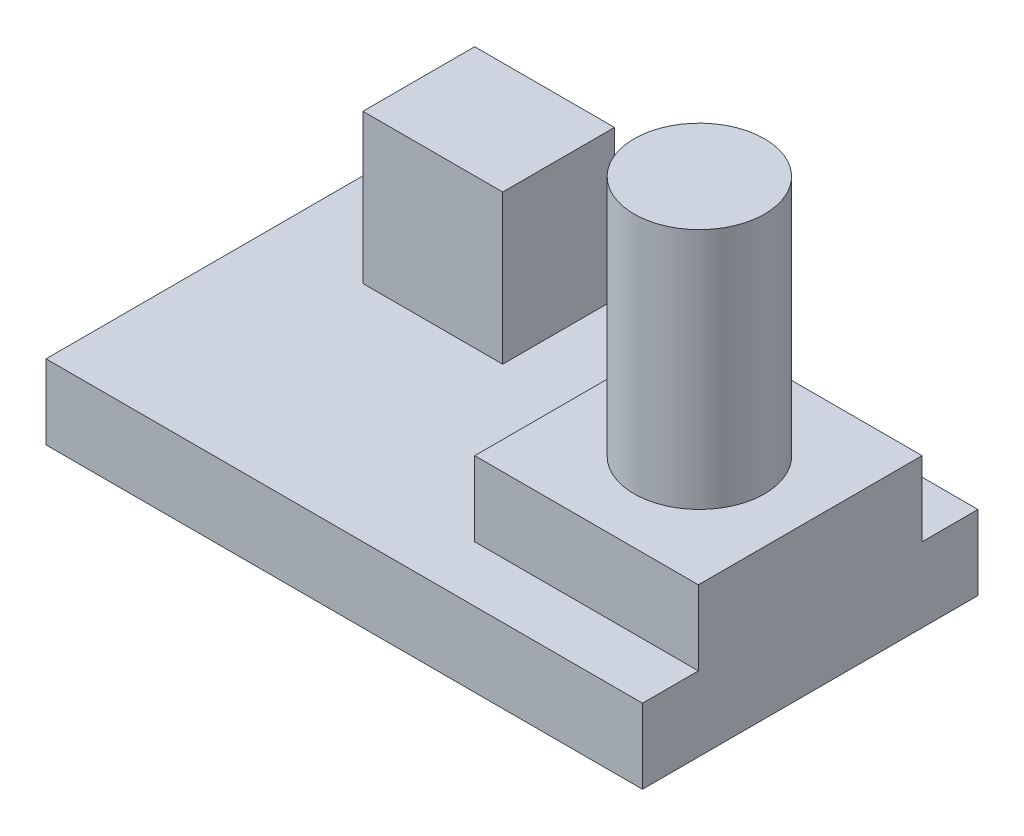
ISO-10303-21;
HEADER;
FILE_DESCRIPTION(('STEP AP214'),'2;1');
FILE_NAME('part.step','',(''),(''),'','','');
FILE_SCHEMA(('AUTOMOTIVE_DESIGN { 1 0 10303 214 1 1 1 1 }'));
ENDSEC;
DATA;
#1=APPLICATION_CONTEXT('core data for automotive mechanical design processes');
#2=APPLICATION_PROTOCOL_DEFINITION('international standard','automotive_design',2000,#1);
#3=PRODUCT_CONTEXT('',#1,'mechanical');
#4=PRODUCT('Part','Part','',(#3));
#5=PRODUCT_RELATED_PRODUCT_CATEGORY('part','',(#4));
#6=PRODUCT_DEFINITION_FORMATION('','',#4);
#7=PRODUCT_DEFINITION_CONTEXT('part definition',#1,'design');
#8=PRODUCT_DEFINITION('design','',#6,#7);
#9=PRODUCT_DEFINITION_SHAPE('','',#8);
#10=(LENGTH_UNIT() NAMED_UNIT(*) SI_UNIT(.MILLI.,.METRE.));
#11=(NAMED_UNIT(*) PLANE_ANGLE_UNIT() SI_UNIT($,.RADIAN.));
#12=(NAMED_UNIT(*) SI_UNIT($,.STERADIAN.) SOLID_ANGLE_UNIT());
#13=UNCERTAINTY_MEASURE_WITH_UNIT(LENGTH_MEASURE(1.E-05),#10,'distance_accuracy_value','');
#14=(GEOMETRIC_REPRESENTATION_CONTEXT(3) GLOBAL_UNCERTAINTY_ASSIGNED_CONTEXT((#13)) GLOBAL_UNIT_ASSIGNED_CONTEXT((#10,
#11,#12)) REPRESENTATION_CONTEXT('',''));
#15=CARTESIAN_POINT('',(0.,0.,0.));
#16=DIRECTION('',(0.,0.,1.));
#17=DIRECTION('',(1.,0.,0.));
#18=AXIS2_PLACEMENT_3D('',#15,#16,#17);
#19=CARTESIAN_POINT('',(0.,4.,0.));
#20=DIRECTION('',(0.,1.,0.));
#21=DIRECTION('',(0.,0.,1.));
#22=AXIS2_PLACEMENT_3D('',#19,#20,#21);
#23=PLANE('',#22);
#24=DIRECTION('',(0.,0.,1.));
#25=VECTOR('',#24,1.);
#26=CARTESIAN_POINT('',(4.,4.,-6.));
#27=LINE('',#26,#25);
#28=CARTESIAN_POINT('',(4.,4.,-6.));
#29=VERTEX_POINT('',#28);
#30=CARTESIAN_POINT('',(4.,4.,6.));
#31=VERTEX_POINT('',#30);
#32=EDGE_CURVE('E372',#29,#31,#27,.T.);
#33=ORIENTED_EDGE('',*,*,#32,.F.);
#34=DIRECTION('',(-1.,0.,0.));
#35=VECTOR('',#34,1.);
#36=CARTESIAN_POINT('',(4.,4.,-6.));
#37=LINE('',#36,#35);
#38=CARTESIAN_POINT('',(16.,4.,-6.));
#39=VERTEX_POINT('',#38);
#40=EDGE_CURVE('E369',#39,#29,#37,.T.);
#41=ORIENTED_EDGE('',*,*,#40,.F.);
#42=DIRECTION('',(0.,0.,-1.));
#43=VECTOR('',#42,1.);
#44=CARTESIAN_POINT('',(16.,4.,-9.));
#45=LINE('',#44,#43);
#46=CARTESIAN_POINT('',(16.,4.,-9.));
#47=VERTEX_POINT('',#46);
#48=EDGE_CURVE('E146',#39,#47,#45,.T.);
#49=ORIENTED_EDGE('',*,*,#48,.T.);
#50=DIRECTION('',(-1.,0.,0.));
#51=VECTOR('',#50,1.);
#52=CARTESIAN_POINT('',(-16.,4.,-9.));
#53=LINE('',#52,#51);
#54=CARTESIAN_POINT('',(-3.5,4.,-9.));
#55=VERTEX_POINT('',#54);
#56=EDGE_CURVE('E183',#47,#55,#53,.T.);
#57=ORIENTED_EDGE('',*,*,#56,.T.);
#58=DIRECTION('',(0.,0.,-1.));
#59=VECTOR('',#58,1.);
#60=CARTESIAN_POINT('',(-3.5,4.,-3.));
#61=LINE('',#60,#59);
#62=CARTESIAN_POINT('',(-3.5,4.,-3.));
#63=VERTEX_POINT('',#62);
#64=EDGE_CURVE('E158',#63,#55,#61,.T.);
#65=ORIENTED_EDGE('',*,*,#64,.F.);
#66=DIRECTION('',(1.,0.,0.));
#67=VECTOR('',#66,1.);
#68=CARTESIAN_POINT('',(-3.5,4.,-3.));
#69=LINE('',#68,#67);
#70=CARTESIAN_POINT('',(-11.,4.,-3.));
#71=VERTEX_POINT('',#70);
#72=EDGE_CURVE('E56',#71,#63,#69,.T.);
#73=ORIENTED_EDGE('',*,*,#72,.F.);
#74=DIRECTION('',(0.,0.,1.));
#75=VECTOR('',#74,1.);
#76=CARTESIAN_POINT('',(-11.,4.,-3.));
#77=LINE('',#76,#75);
#78=CARTESIAN_POINT('',(-11.,4.,-9.));
#79=VERTEX_POINT('',#78);
#80=EDGE_CURVE('E147',#79,#71,#77,.T.);
#81=ORIENTED_EDGE('',*,*,#80,.F.);
#82=CARTESIAN_POINT('',(-16.,4.,-9.));
#83=VERTEX_POINT('',#82);
#84=EDGE_CURVE('E182',#79,#83,#53,.T.);
#85=ORIENTED_EDGE('',*,*,#84,.T.);
#86=DIRECTION('',(0.,0.,1.));
#87=VECTOR('',#86,1.);
#88=CARTESIAN_POINT('',(-16.,4.,-9.));
#89=LINE('',#88,#87);
#90=CARTESIAN_POINT('',(-16.,4.,9.));
#91=VERTEX_POINT('',#90);
#92=EDGE_CURVE('E185',#83,#91,#89,.T.);
#93=ORIENTED_EDGE('',*,*,#92,.T.);
#94=DIRECTION('',(1.,0.,0.));
#95=VECTOR('',#94,1.);
#96=CARTESIAN_POINT('',(-16.,4.,9.));
#97=LINE('',#96,#95);
#98=CARTESIAN_POINT('',(16.,4.,9.));
#99=VERTEX_POINT('',#98);
#100=EDGE_CURVE('E187',#91,#99,#97,.T.);
#101=ORIENTED_EDGE('',*,*,#100,.T.);
#102=CARTESIAN_POINT('',(16.,4.,6.));
#103=VERTEX_POINT('',#102);
#104=EDGE_CURVE('E179',#99,#103,#45,.T.);
#105=ORIENTED_EDGE('',*,*,#104,.T.);
#106=DIRECTION('',(1.,0.,0.));
#107=VECTOR('',#106,1.);
#108=CARTESIAN_POINT('',(4.,4.,6.));
#109=LINE('',#108,#107);
#110=EDGE_CURVE('E141',#31,#103,#109,.T.);
#111=ORIENTED_EDGE('',*,*,#110,.F.);
#112=EDGE_LOOP('',(#33,#41,#49,#57,#65,#73,#81,#85,#93,#101,#105,#111));
#113=FACE_BOUND('',#112,.T.);
#114=ADVANCED_FACE('F33',(#113),#23,.T.);
#115=CARTESIAN_POINT('',(16.,4.,-9.));
#116=DIRECTION('',(-1.,0.,0.));
#117=DIRECTION('',(0.,0.,1.));
#118=AXIS2_PLACEMENT_3D('',#115,#116,#117);
#119=PLANE('',#118);
#120=DIRECTION('',(0.,0.,-1.));
#121=VECTOR('',#120,1.);
#122=CARTESIAN_POINT('',(16.,0.,-9.));
#123=LINE('',#122,#121);
#124=CARTESIAN_POINT('',(16.,0.,9.));
#125=VERTEX_POINT('',#124);
#126=CARTESIAN_POINT('',(16.,0.,-9.));
#127=VERTEX_POINT('',#126);
#128=EDGE_CURVE('E178',#125,#127,#123,.T.);
#129=ORIENTED_EDGE('',*,*,#128,.T.);
#130=DIRECTION('',(0.,-1.,0.));
#131=VECTOR('',#130,1.);
#132=CARTESIAN_POINT('',(16.,4.,-9.));
#133=LINE('',#132,#131);
#134=EDGE_CURVE('E11',#47,#127,#133,.T.);
#135=ORIENTED_EDGE('',*,*,#134,.F.);
#136=ORIENTED_EDGE('',*,*,#48,.F.);
#137=DIRECTION('',(0.,-1.,0.));
#138=VECTOR('',#137,1.);
#139=CARTESIAN_POINT('',(16.,8.,-6.));
#140=LINE('',#139,#138);
#141=CARTESIAN_POINT('',(16.,8.,-6.));
#142=VERTEX_POINT('',#141);
#143=EDGE_CURVE('E126',#142,#39,#140,.T.);
#144=ORIENTED_EDGE('',*,*,#143,.F.);
#145=DIRECTION('',(0.,0.,-1.));
#146=VECTOR('',#145,1.);
#147=CARTESIAN_POINT('',(16.,8.,-6.));
#148=LINE('',#147,#146);
#149=CARTESIAN_POINT('',(16.,8.,6.));
#150=VERTEX_POINT('',#149);
#151=EDGE_CURVE('E133',#150,#142,#148,.T.);
#152=ORIENTED_EDGE('',*,*,#151,.F.);
#153=DIRECTION('',(0.,-1.,0.));
#154=VECTOR('',#153,1.);
#155=CARTESIAN_POINT('',(16.,8.,6.));
#156=LINE('',#155,#154);
#157=EDGE_CURVE('E219',#150,#103,#156,.T.);
#158=ORIENTED_EDGE('',*,*,#157,.T.);
#159=ORIENTED_EDGE('',*,*,#104,.F.);
#160=DIRECTION('',(0.,-1.,0.));
#161=VECTOR('',#160,1.);
#162=CARTESIAN_POINT('',(16.,4.,9.));
#163=LINE('',#162,#161);
#164=EDGE_CURVE('E189',#99,#125,#163,.T.);
#165=ORIENTED_EDGE('',*,*,#164,.T.);
#166=EDGE_LOOP('',(#129,#135,#136,#144,#152,#158,#159,#165));
#167=FACE_BOUND('',#166,.T.);
#168=ADVANCED_FACE('F35',(#167),#119,.F.);
#169=CARTESIAN_POINT('',(-16.,4.,-9.));
#170=DIRECTION('',(0.,0.,1.));
#171=DIRECTION('',(1.,0.,0.));
#172=AXIS2_PLACEMENT_3D('',#169,#170,#171);
#173=PLANE('',#172);
#174=DIRECTION('',(-1.,0.,0.));
#175=VECTOR('',#174,1.);
#176=CARTESIAN_POINT('',(-16.,0.,-9.));
#177=LINE('',#176,#175);
#178=CARTESIAN_POINT('',(-16.,0.,-9.));
#179=VERTEX_POINT('',#178);
#180=EDGE_CURVE('E191',#127,#179,#177,.T.);
#181=ORIENTED_EDGE('',*,*,#180,.T.);
#182=DIRECTION('',(0.,-1.,0.));
#183=VECTOR('',#182,1.);
#184=CARTESIAN_POINT('',(-16.,4.,-9.));
#185=LINE('',#184,#183);
#186=EDGE_CURVE('E41',#83,#179,#185,.T.);
#187=ORIENTED_EDGE('',*,*,#186,.F.);
#188=ORIENTED_EDGE('',*,*,#84,.F.);
#189=DIRECTION('',(0.,-1.,0.));
#190=VECTOR('',#189,1.);
#191=CARTESIAN_POINT('',(-11.,12.,-9.));
#192=LINE('',#191,#190);
#193=CARTESIAN_POINT('',(-11.,12.,-9.));
#194=VERTEX_POINT('',#193);
#195=EDGE_CURVE('E163',#194,#79,#192,.T.);
#196=ORIENTED_EDGE('',*,*,#195,.F.);
#197=DIRECTION('',(-1.,0.,0.));
#198=VECTOR('',#197,1.);
#199=CARTESIAN_POINT('',(-3.5,12.,-9.));
#200=LINE('',#199,#198);
#201=CARTESIAN_POINT('',(-3.5,12.,-9.));
#202=VERTEX_POINT('',#201);
#203=EDGE_CURVE('E162',#202,#194,#200,.T.);
#204=ORIENTED_EDGE('',*,*,#203,.F.);
#205=DIRECTION('',(0.,-1.,0.));
#206=VECTOR('',#205,1.);
#207=CARTESIAN_POINT('',(-3.5,12.,-9.));
#208=LINE('',#207,#206);
#209=EDGE_CURVE('E170',#202,#55,#208,.T.);
#210=ORIENTED_EDGE('',*,*,#209,.T.);
#211=ORIENTED_EDGE('',*,*,#56,.F.);
#212=ORIENTED_EDGE('',*,*,#134,.T.);
#213=EDGE_LOOP('',(#181,#187,#188,#196,#204,#210,#211,#212));
#214=FACE_BOUND('',#213,.T.);
#215=ADVANCED_FACE('F223',(#214),#173,.F.);
#216=CARTESIAN_POINT('',(-16.,4.,-9.));
#217=DIRECTION('',(1.,0.,0.));
#218=DIRECTION('',(0.,0.,-1.));
#219=AXIS2_PLACEMENT_3D('',#216,#217,#218);
#220=PLANE('',#219);
#221=DIRECTION('',(0.,0.,1.));
#222=VECTOR('',#221,1.);
#223=CARTESIAN_POINT('',(-16.,0.,-9.));
#224=LINE('',#223,#222);
#225=CARTESIAN_POINT('',(-16.,0.,9.));
#226=VERTEX_POINT('',#225);
#227=EDGE_CURVE('E193',#179,#226,#224,.T.);
#228=ORIENTED_EDGE('',*,*,#227,.T.);
#229=DIRECTION('',(0.,-1.,0.));
#230=VECTOR('',#229,1.);
#231=CARTESIAN_POINT('',(-16.,4.,9.));
#232=LINE('',#231,#230);
#233=EDGE_CURVE('E199',#91,#226,#232,.T.);
#234=ORIENTED_EDGE('',*,*,#233,.F.);
#235=ORIENTED_EDGE('',*,*,#92,.F.);
#236=ORIENTED_EDGE('',*,*,#186,.T.);
#237=EDGE_LOOP('',(#228,#234,#235,#236));
#238=FACE_BOUND('',#237,.T.);
#239=ADVANCED_FACE('F206',(#238),#220,.F.);
#240=CARTESIAN_POINT('',(-16.,4.,9.));
#241=DIRECTION('',(0.,0.,-1.));
#242=DIRECTION('',(-1.,0.,0.));
#243=AXIS2_PLACEMENT_3D('',#240,#241,#242);
#244=PLANE('',#243);
#245=DIRECTION('',(1.,0.,0.));
#246=VECTOR('',#245,1.);
#247=CARTESIAN_POINT('',(-16.,0.,9.));
#248=LINE('',#247,#246);
#249=EDGE_CURVE('E195',#226,#125,#248,.T.);
#250=ORIENTED_EDGE('',*,*,#249,.T.);
#251=ORIENTED_EDGE('',*,*,#164,.F.);
#252=ORIENTED_EDGE('',*,*,#100,.F.);
#253=ORIENTED_EDGE('',*,*,#233,.T.);
#254=EDGE_LOOP('',(#250,#251,#252,#253));
#255=FACE_BOUND('',#254,.T.);
#256=ADVANCED_FACE('F216',(#255),#244,.F.);
#257=CARTESIAN_POINT('',(0.,0.,0.));
#258=DIRECTION('',(0.,1.,0.));
#259=DIRECTION('',(0.,0.,1.));
#260=AXIS2_PLACEMENT_3D('',#257,#258,#259);
#261=PLANE('',#260);
#262=ORIENTED_EDGE('',*,*,#128,.F.);
#263=ORIENTED_EDGE('',*,*,#249,.F.);
#264=ORIENTED_EDGE('',*,*,#227,.F.);
#265=ORIENTED_EDGE('',*,*,#180,.F.);
#266=EDGE_LOOP('',(#262,#263,#264,#265));
#267=FACE_BOUND('',#266,.T.);
#268=ADVANCED_FACE('F213',(#267),#261,.F.);
#269=CARTESIAN_POINT('',(-11.,12.,-3.));
#270=DIRECTION('',(1.,0.,0.));
#271=DIRECTION('',(0.,0.,-1.));
#272=AXIS2_PLACEMENT_3D('',#269,#270,#271);
#273=PLANE('',#272);
#274=ORIENTED_EDGE('',*,*,#80,.T.);
#275=DIRECTION('',(0.,-1.,0.));
#276=VECTOR('',#275,1.);
#277=CARTESIAN_POINT('',(-11.,12.,-3.));
#278=LINE('',#277,#276);
#279=CARTESIAN_POINT('',(-11.,12.,-3.));
#280=VERTEX_POINT('',#279);
#281=EDGE_CURVE('E176',#280,#71,#278,.T.);
#282=ORIENTED_EDGE('',*,*,#281,.F.);
#283=DIRECTION('',(0.,0.,1.));
#284=VECTOR('',#283,1.);
#285=CARTESIAN_POINT('',(-11.,12.,-3.));
#286=LINE('',#285,#284);
#287=EDGE_CURVE('E154',#194,#280,#286,.T.);
#288=ORIENTED_EDGE('',*,*,#287,.F.);
#289=ORIENTED_EDGE('',*,*,#195,.T.);
#290=EDGE_LOOP('',(#274,#282,#288,#289));
#291=FACE_BOUND('',#290,.T.);
#292=ADVANCED_FACE('F227',(#291),#273,.F.);
#293=CARTESIAN_POINT('',(-3.5,12.,-3.));
#294=DIRECTION('',(0.,0.,-1.));
#295=DIRECTION('',(-1.,0.,0.));
#296=AXIS2_PLACEMENT_3D('',#293,#294,#295);
#297=PLANE('',#296);
#298=ORIENTED_EDGE('',*,*,#72,.T.);
#299=DIRECTION('',(0.,-1.,0.));
#300=VECTOR('',#299,1.);
#301=CARTESIAN_POINT('',(-3.5,12.,-3.));
#302=LINE('',#301,#300);
#303=CARTESIAN_POINT('',(-3.5,12.,-3.));
#304=VERTEX_POINT('',#303);
#305=EDGE_CURVE('E173',#304,#63,#302,.T.);
#306=ORIENTED_EDGE('',*,*,#305,.F.);
#307=DIRECTION('',(1.,0.,0.));
#308=VECTOR('',#307,1.);
#309=CARTESIAN_POINT('',(-3.5,12.,-3.));
#310=LINE('',#309,#308);
#311=EDGE_CURVE('E157',#280,#304,#310,.T.);
#312=ORIENTED_EDGE('',*,*,#311,.F.);
#313=ORIENTED_EDGE('',*,*,#281,.T.);
#314=EDGE_LOOP('',(#298,#306,#312,#313));
#315=FACE_BOUND('',#314,.T.);
#316=ADVANCED_FACE('F238',(#315),#297,.F.);
#317=CARTESIAN_POINT('',(-3.5,12.,-3.));
#318=DIRECTION('',(-1.,0.,0.));
#319=DIRECTION('',(0.,0.,1.));
#320=AXIS2_PLACEMENT_3D('',#317,#318,#319);
#321=PLANE('',#320);
#322=ORIENTED_EDGE('',*,*,#64,.T.);
#323=ORIENTED_EDGE('',*,*,#209,.F.);
#324=DIRECTION('',(0.,0.,-1.));
#325=VECTOR('',#324,1.);
#326=CARTESIAN_POINT('',(-3.5,12.,-3.));
#327=LINE('',#326,#325);
#328=EDGE_CURVE('E160',#304,#202,#327,.T.);
#329=ORIENTED_EDGE('',*,*,#328,.F.);
#330=ORIENTED_EDGE('',*,*,#305,.T.);
#331=EDGE_LOOP('',(#322,#323,#329,#330));
#332=FACE_BOUND('',#331,.T.);
#333=ADVANCED_FACE('F236',(#332),#321,.F.);
#334=CARTESIAN_POINT('',(0.,12.,0.));
#335=DIRECTION('',(0.,1.,0.));
#336=DIRECTION('',(0.,0.,1.));
#337=AXIS2_PLACEMENT_3D('',#334,#335,#336);
#338=PLANE('',#337);
#339=ORIENTED_EDGE('',*,*,#287,.T.);
#340=ORIENTED_EDGE('',*,*,#311,.T.);
#341=ORIENTED_EDGE('',*,*,#328,.T.);
#342=ORIENTED_EDGE('',*,*,#203,.T.);
#343=EDGE_LOOP('',(#339,#340,#341,#342));
#344=FACE_BOUND('',#343,.T.);
#345=ADVANCED_FACE('F230',(#344),#338,.T.);
#346=CARTESIAN_POINT('',(4.,8.,-6.));
#347=DIRECTION('',(0.,0.,1.));
#348=DIRECTION('',(1.,0.,0.));
#349=AXIS2_PLACEMENT_3D('',#346,#347,#348);
#350=PLANE('',#349);
#351=ORIENTED_EDGE('',*,*,#40,.T.);
#352=DIRECTION('',(0.,-1.,0.));
#353=VECTOR('',#352,1.);
#354=CARTESIAN_POINT('',(4.,8.,-6.));
#355=LINE('',#354,#353);
#356=CARTESIAN_POINT('',(4.,8.,-6.));
#357=VERTEX_POINT('',#356);
#358=EDGE_CURVE('E129',#357,#29,#355,.T.);
#359=ORIENTED_EDGE('',*,*,#358,.F.);
#360=DIRECTION('',(-1.,0.,0.));
#361=VECTOR('',#360,1.);
#362=CARTESIAN_POINT('',(4.,8.,-6.));
#363=LINE('',#362,#361);
#364=EDGE_CURVE('E122',#142,#357,#363,.T.);
#365=ORIENTED_EDGE('',*,*,#364,.F.);
#366=ORIENTED_EDGE('',*,*,#143,.T.);
#367=EDGE_LOOP('',(#351,#359,#365,#366));
#368=FACE_BOUND('',#367,.T.);
#369=ADVANCED_FACE('F124',(#368),#350,.F.);
#370=CARTESIAN_POINT('',(4.,8.,-6.));
#371=DIRECTION('',(1.,0.,0.));
#372=DIRECTION('',(0.,0.,-1.));
#373=AXIS2_PLACEMENT_3D('',#370,#371,#372);
#374=PLANE('',#373);
#375=ORIENTED_EDGE('',*,*,#32,.T.);
#376=DIRECTION('',(0.,-1.,0.));
#377=VECTOR('',#376,1.);
#378=CARTESIAN_POINT('',(4.,8.,6.));
#379=LINE('',#378,#377);
#380=CARTESIAN_POINT('',(4.,8.,6.));
#381=VERTEX_POINT('',#380);
#382=EDGE_CURVE('E48',#381,#31,#379,.T.);
#383=ORIENTED_EDGE('',*,*,#382,.F.);
#384=DIRECTION('',(0.,0.,1.));
#385=VECTOR('',#384,1.);
#386=CARTESIAN_POINT('',(4.,8.,-6.));
#387=LINE('',#386,#385);
#388=EDGE_CURVE('E132',#357,#381,#387,.T.);
#389=ORIENTED_EDGE('',*,*,#388,.F.);
#390=ORIENTED_EDGE('',*,*,#358,.T.);
#391=EDGE_LOOP('',(#375,#383,#389,#390));
#392=FACE_BOUND('',#391,.T.);
#393=ADVANCED_FACE('F315',(#392),#374,.F.);
#394=CARTESIAN_POINT('',(4.,8.,6.));
#395=DIRECTION('',(0.,0.,-1.));
#396=DIRECTION('',(-1.,0.,0.));
#397=AXIS2_PLACEMENT_3D('',#394,#395,#396);
#398=PLANE('',#397);
#399=ORIENTED_EDGE('',*,*,#110,.T.);
#400=ORIENTED_EDGE('',*,*,#157,.F.);
#401=DIRECTION('',(1.,0.,0.));
#402=VECTOR('',#401,1.);
#403=CARTESIAN_POINT('',(4.,8.,6.));
#404=LINE('',#403,#402);
#405=EDGE_CURVE('E137',#381,#150,#404,.T.);
#406=ORIENTED_EDGE('',*,*,#405,.F.);
#407=ORIENTED_EDGE('',*,*,#382,.T.);
#408=EDGE_LOOP('',(#399,#400,#406,#407));
#409=FACE_BOUND('',#408,.T.);
#410=ADVANCED_FACE('F324',(#409),#398,.F.);
#411=CARTESIAN_POINT('',(0.,8.,0.));
#412=DIRECTION('',(0.,1.,0.));
#413=DIRECTION('',(0.,0.,1.));
#414=AXIS2_PLACEMENT_3D('',#411,#412,#413);
#415=PLANE('',#414);
#416=CARTESIAN_POINT('',(10.0510129227516,8.,0.));
#417=DIRECTION('',(0.,1.,0.));
#418=DIRECTION('',(0.,0.,1.));
#419=AXIS2_PLACEMENT_3D('',#416,#417,#418);
#420=CIRCLE('',#419,3.5);
#421=CARTESIAN_POINT('',(10.0510129227516,8.,-3.5));
#422=VERTEX_POINT('',#421);
#423=EDGE_CURVE('E370',#422,#422,#420,.T.);
#424=ORIENTED_EDGE('',*,*,#423,.F.);
#425=EDGE_LOOP('',(#424));
#426=FACE_BOUND('',#425,.T.);
#427=ORIENTED_EDGE('',*,*,#151,.T.);
#428=ORIENTED_EDGE('',*,*,#364,.T.);
#429=ORIENTED_EDGE('',*,*,#388,.T.);
#430=ORIENTED_EDGE('',*,*,#405,.T.);
#431=EDGE_LOOP('',(#427,#428,#429,#430));
#432=FACE_BOUND('',#431,.T.);
#433=ADVANCED_FACE('F136',(#426,#432),#415,.T.);
#434=CARTESIAN_POINT('',(10.0510129227516,21.,0.));
#435=DIRECTION('',(0.,-1.,0.));
#436=DIRECTION('',(0.,0.,-1.));
#437=AXIS2_PLACEMENT_3D('',#434,#435,#436);
#438=CYLINDRICAL_SURFACE('',#437,3.5);
#439=CARTESIAN_POINT('',(10.0510129227516,21.,0.));
#440=DIRECTION('',(0.,1.,0.));
#441=DIRECTION('',(0.,0.,1.));
#442=AXIS2_PLACEMENT_3D('',#439,#440,#441);
#443=CIRCLE('',#442,3.5);
#444=CARTESIAN_POINT('',(10.0510129227516,21.,-3.5));
#445=VERTEX_POINT('',#444);
#446=EDGE_CURVE('E368',#445,#445,#443,.T.);
#447=CARTESIAN_POINT('',(10.0510129227516,21.,-3.5));
#448=CARTESIAN_POINT('',(10.0510129227516,20.8645833333333,-3.5));
#449=CARTESIAN_POINT('',(10.0510129227516,20.7291666666667,-3.5));
#450=CARTESIAN_POINT('',(10.0510129227516,20.4583333333333,-3.5));
#451=CARTESIAN_POINT('',(10.0510129227516,20.3229166666667,-3.5));
#452=CARTESIAN_POINT('',(10.0510129227516,20.0520833333333,-3.5));
#453=CARTESIAN_POINT('',(10.0510129227516,19.9166666666667,-3.5));
#454=CARTESIAN_POINT('',(10.0510129227516,19.6458333333333,-3.5));
#455=CARTESIAN_POINT('',(10.0510129227516,19.5104166666667,-3.5));
#456=CARTESIAN_POINT('',(10.0510129227516,19.2395833333333,-3.5));
#457=CARTESIAN_POINT('',(10.0510129227516,19.1041666666667,-3.5));
#458=CARTESIAN_POINT('',(10.0510129227516,18.8333333333333,-3.5));
#459=CARTESIAN_POINT('',(10.0510129227516,18.6979166666667,-3.5));
#460=CARTESIAN_POINT('',(10.0510129227516,18.4270833333333,-3.5));
#461=CARTESIAN_POINT('',(10.0510129227516,18.2916666666667,-3.5));
#462=CARTESIAN_POINT('',(10.0510129227516,18.0208333333333,-3.5));
#463=CARTESIAN_POINT('',(10.0510129227516,17.8854166666667,-3.5));
#464=CARTESIAN_POINT('',(10.0510129227516,17.6145833333333,-3.5));
#465=CARTESIAN_POINT('',(10.0510129227516,17.4791666666667,-3.5));
#466=CARTESIAN_POINT('',(10.0510129227516,17.2083333333333,-3.5));
#467=CARTESIAN_POINT('',(10.0510129227516,17.0729166666667,-3.5));
#468=CARTESIAN_POINT('',(10.0510129227516,16.8020833333333,-3.5));
#469=CARTESIAN_POINT('',(10.0510129227516,16.6666666666667,-3.5));
#470=CARTESIAN_POINT('',(10.0510129227516,16.3958333333333,-3.5));
#471=CARTESIAN_POINT('',(10.0510129227516,16.2604166666667,-3.5));
#472=CARTESIAN_POINT('',(10.0510129227516,15.9895833333333,-3.5));
#473=CARTESIAN_POINT('',(10.0510129227516,15.8541666666667,-3.5));
#474=CARTESIAN_POINT('',(10.0510129227516,15.5833333333333,-3.5));
#475=CARTESIAN_POINT('',(10.0510129227516,15.4479166666667,-3.5));
#476=CARTESIAN_POINT('',(10.0510129227516,15.1770833333333,-3.5));
#477=CARTESIAN_POINT('',(10.0510129227516,15.0416666666667,-3.5));
#478=CARTESIAN_POINT('',(10.0510129227516,14.7708333333333,-3.5));
#479=CARTESIAN_POINT('',(10.0510129227516,14.6354166666667,-3.5));
#480=CARTESIAN_POINT('',(10.0510129227516,14.3645833333333,-3.5));
#481=CARTESIAN_POINT('',(10.0510129227516,14.2291666666667,-3.5));
#482=CARTESIAN_POINT('',(10.0510129227516,13.9583333333333,-3.5));
#483=CARTESIAN_POINT('',(10.0510129227516,13.8229166666667,-3.5));
#484=CARTESIAN_POINT('',(10.0510129227516,13.5520833333333,-3.5));
#485=CARTESIAN_POINT('',(10.0510129227516,13.4166666666667,-3.5));
#486=CARTESIAN_POINT('',(10.0510129227516,13.1458333333333,-3.5));
#487=CARTESIAN_POINT('',(10.0510129227516,13.0104166666667,-3.5));
#488=CARTESIAN_POINT('',(10.0510129227516,12.7395833333333,-3.5));
#489=CARTESIAN_POINT('',(10.0510129227516,12.6041666666667,-3.5));
#490=CARTESIAN_POINT('',(10.0510129227516,12.3333333333333,-3.5));
#491=CARTESIAN_POINT('',(10.0510129227516,12.1979166666667,-3.5));
#492=CARTESIAN_POINT('',(10.0510129227516,11.9270833333333,-3.5));
#493=CARTESIAN_POINT('',(10.0510129227516,11.7916666666667,-3.5));
#494=CARTESIAN_POINT('',(10.0510129227516,11.5208333333333,-3.5));
#495=CARTESIAN_POINT('',(10.0510129227516,11.3854166666667,-3.5));
#496=CARTESIAN_POINT('',(10.0510129227516,11.1145833333333,-3.5));
#497=CARTESIAN_POINT('',(10.0510129227516,10.9791666666667,-3.5));
#498=CARTESIAN_POINT('',(10.0510129227516,10.7083333333333,-3.5));
#499=CARTESIAN_POINT('',(10.0510129227516,10.5729166666667,-3.5));
#500=CARTESIAN_POINT('',(10.0510129227516,10.3020833333333,-3.5));
#501=CARTESIAN_POINT('',(10.0510129227516,10.1666666666667,-3.5));
#502=CARTESIAN_POINT('',(10.0510129227516,9.89583333333333,-3.5));
#503=CARTESIAN_POINT('',(10.0510129227516,9.76041666666667,-3.5));
#504=CARTESIAN_POINT('',(10.0510129227516,9.48958333333333,-3.5));
#505=CARTESIAN_POINT('',(10.0510129227516,9.35416666666666,-3.5));
#506=CARTESIAN_POINT('',(10.0510129227516,9.08333333333333,-3.5));
#507=CARTESIAN_POINT('',(10.0510129227516,8.94791666666666,-3.5));
#508=CARTESIAN_POINT('',(10.0510129227516,8.67708333333333,-3.5));
#509=CARTESIAN_POINT('',(10.0510129227516,8.54166666666667,-3.5));
#510=CARTESIAN_POINT('',(10.0510129227516,8.27083333333333,-3.5));
#511=CARTESIAN_POINT('',(10.0510129227516,8.13541666666667,-3.5));
#512=CARTESIAN_POINT('',(10.0510129227516,8.,-3.5));
#513=B_SPLINE_CURVE_WITH_KNOTS('',3,(#447,#448,#449,#450,#451,#452,#453,#454,#455,#456,#457,
#458,#459,#460,#461,#462,#463,#464,#465,#466,#467,#468,#469,#470,#471,#472,#473,#474,#475,#476,
#477,#478,#479,#480,#481,#482,#483,#484,#485,#486,#487,#488,#489,#490,#491,#492,#493,#494,#495,
#496,#497,#498,#499,#500,#501,#502,#503,#504,#505,#506,#507,#508,#509,#510,#511,#512),
.UNSPECIFIED.,.F.,.F.,(4,2,2,2,2,2,2,2,2,2,2,2,2,2,2,2,2,2,2,2,2,2,2,2,2,2,2,2,2,2,2,2,4),(0.,
0.40625,0.812500000000001,1.21875,1.625,2.03125,2.4375,2.84375,3.25,3.65625,4.0625,4.46875,
4.875,5.28125,5.6875,6.09375,6.5,6.90625,7.3125,7.71875,8.125,8.53125,8.9375,9.34375,9.75,
10.15625,10.5625,10.96875,11.375,11.78125,12.1875,12.59375,13.),.UNSPECIFIED.);
#514=EDGE_CURVE('BSEAM342',#445,#422,#513,.T.);
#515=ORIENTED_EDGE('',*,*,#446,.F.);
#516=ORIENTED_EDGE('',*,*,#423,.T.);
#517=ORIENTED_EDGE('',*,*,#514,.T.);
#518=ORIENTED_EDGE('',*,*,#514,.F.);
#519=EDGE_LOOP('',(#515,#517,#516,#518));
#520=FACE_BOUND('',#519,.T.);
#521=ADVANCED_FACE('F342',(#520),#438,.T.);
#522=CARTESIAN_POINT('',(10.0510129227516,21.,0.));
#523=DIRECTION('',(0.,1.,0.));
#524=DIRECTION('',(0.,0.,1.));
#525=AXIS2_PLACEMENT_3D('',#522,#523,#524);
#526=PLANE('',#525);
#527=ORIENTED_EDGE('',*,*,#446,.T.);
#528=EDGE_LOOP('',(#527));
#529=FACE_BOUND('',#528,.T.);
#530=ADVANCED_FACE('F352',(#529),#526,.T.);
#531=CLOSED_SHELL('',(#114,#168,#215,#239,#256,#268,#292,#316,#333,#345,#369,#393,#410,#433,
#521,#530));
#532=MANIFOLD_SOLID_BREP('B2',#531);
#533=ADVANCED_BREP_SHAPE_REPRESENTATION('',(#18,#532),#14);
#534=SHAPE_DEFINITION_REPRESENTATION(#9,#533);
ENDSEC;
END-ISO-10303-21;
